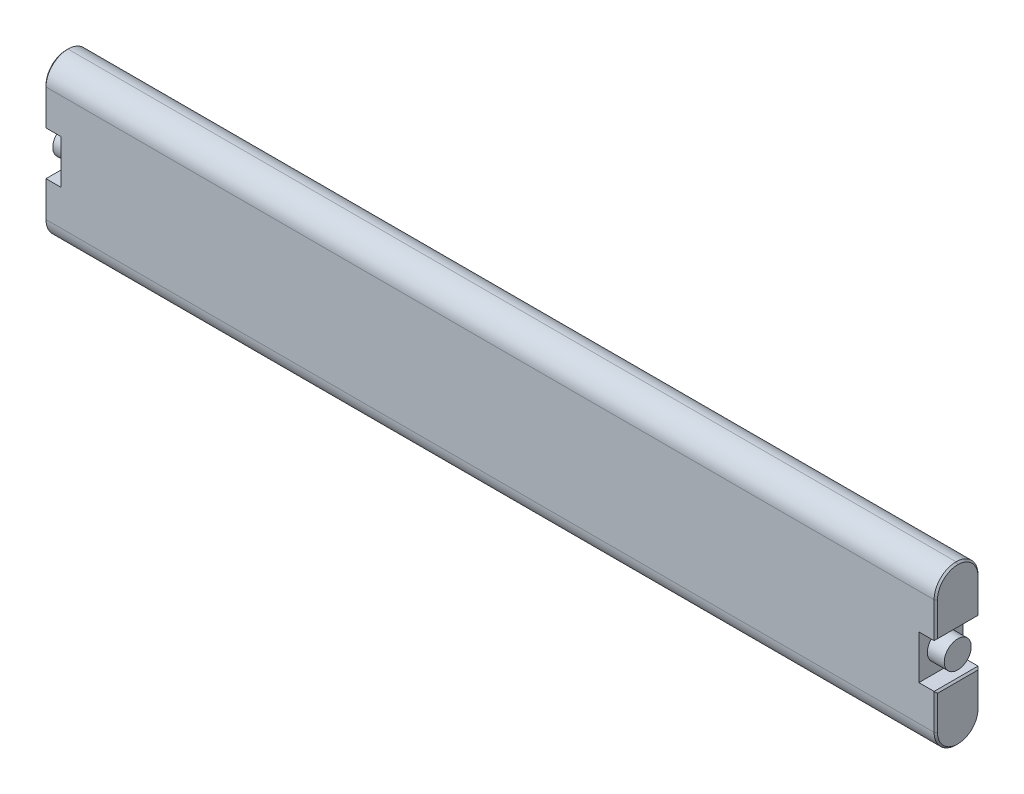
ISO-10303-21;
HEADER;
FILE_DESCRIPTION(('STEP AP214'),'2;1');
FILE_NAME('part.step','',(''),(''),'','','');
FILE_SCHEMA(('AUTOMOTIVE_DESIGN { 1 0 10303 214 1 1 1 1 }'));
ENDSEC;
DATA;
#1=APPLICATION_CONTEXT('core data for automotive mechanical design processes');
#2=APPLICATION_PROTOCOL_DEFINITION('international standard','automotive_design',2000,#1);
#3=PRODUCT_CONTEXT('',#1,'mechanical');
#4=PRODUCT('Part','Part','',(#3));
#5=PRODUCT_RELATED_PRODUCT_CATEGORY('part','',(#4));
#6=PRODUCT_DEFINITION_FORMATION('','',#4);
#7=PRODUCT_DEFINITION_CONTEXT('part definition',#1,'design');
#8=PRODUCT_DEFINITION('design','',#6,#7);
#9=PRODUCT_DEFINITION_SHAPE('','',#8);
#10=(LENGTH_UNIT() NAMED_UNIT(*) SI_UNIT(.MILLI.,.METRE.));
#11=(NAMED_UNIT(*) PLANE_ANGLE_UNIT() SI_UNIT($,.RADIAN.));
#12=(NAMED_UNIT(*) SI_UNIT($,.STERADIAN.) SOLID_ANGLE_UNIT());
#13=UNCERTAINTY_MEASURE_WITH_UNIT(LENGTH_MEASURE(1.E-05),#10,'distance_accuracy_value','');
#14=(GEOMETRIC_REPRESENTATION_CONTEXT(3) GLOBAL_UNCERTAINTY_ASSIGNED_CONTEXT((#13)) GLOBAL_UNIT_ASSIGNED_CONTEXT((#10,
#11,#12)) REPRESENTATION_CONTEXT('',''));
#15=CARTESIAN_POINT('',(0.,0.,0.));
#16=DIRECTION('',(0.,0.,1.));
#17=DIRECTION('',(1.,0.,0.));
#18=AXIS2_PLACEMENT_3D('',#15,#16,#17);
#19=CARTESIAN_POINT('',(-66.,3.25,6.5));
#20=DIRECTION('',(1.,0.,0.));
#21=DIRECTION('',(0.,0.,-1.));
#22=AXIS2_PLACEMENT_3D('',#19,#20,#21);
#23=PLANE('',#22);
#24=DIRECTION('',(0.,-1.,0.));
#25=VECTOR('',#24,1.);
#26=CARTESIAN_POINT('',(-66.,3.25,0.249999999999986));
#27=LINE('',#26,#25);
#28=CARTESIAN_POINT('',(-66.,8.5,0.249999999999986));
#29=VERTEX_POINT('',#28);
#30=CARTESIAN_POINT('',(-66.,3.49999999999999,0.249999999999986));
#31=VERTEX_POINT('',#30);
#32=EDGE_CURVE('E52',#29,#31,#27,.T.);
#33=ORIENTED_EDGE('',*,*,#32,.T.);
#34=DIRECTION('',(0.,0.,1.));
#35=VECTOR('',#34,1.);
#36=CARTESIAN_POINT('',(-66.,3.49999999999999,6.5));
#37=LINE('',#36,#35);
#38=CARTESIAN_POINT('',(-66.,3.49999999999999,6.25000000000001));
#39=VERTEX_POINT('',#38);
#40=EDGE_CURVE('E11',#31,#39,#37,.T.);
#41=ORIENTED_EDGE('',*,*,#40,.T.);
#42=DIRECTION('',(0.,1.,0.));
#43=VECTOR('',#42,1.);
#44=CARTESIAN_POINT('',(-66.,3.25,6.25000000000001));
#45=LINE('',#44,#43);
#46=CARTESIAN_POINT('',(-66.,8.5,6.25000000000001));
#47=VERTEX_POINT('',#46);
#48=EDGE_CURVE('E363',#39,#47,#45,.T.);
#49=ORIENTED_EDGE('',*,*,#48,.T.);
#50=CARTESIAN_POINT('',(-66.,8.5,3.25));
#51=DIRECTION('',(1.,0.,0.));
#52=DIRECTION('',(0.,0.,-1.));
#53=AXIS2_PLACEMENT_3D('',#50,#51,#52);
#54=CIRCLE('',#53,3.00000000000001);
#55=CARTESIAN_POINT('',(-66.,11.5,3.25));
#56=VERTEX_POINT('',#55);
#57=EDGE_CURVE('E365',#47,#56,#54,.F.);
#58=ORIENTED_EDGE('',*,*,#57,.T.);
#59=CARTESIAN_POINT('',(-66.,8.5,3.25));
#60=DIRECTION('',(1.,0.,0.));
#61=DIRECTION('',(0.,0.,-1.));
#62=AXIS2_PLACEMENT_3D('',#59,#60,#61);
#63=CIRCLE('',#62,3.00000000000001);
#64=EDGE_CURVE('E63',#56,#29,#63,.F.);
#65=ORIENTED_EDGE('',*,*,#64,.T.);
#66=EDGE_LOOP('',(#33,#41,#49,#58,#65));
#67=FACE_BOUND('',#66,.T.);
#68=ADVANCED_FACE('F42',(#67),#23,.F.);
#69=CARTESIAN_POINT('',(-63.5,3.25,6.5));
#70=DIRECTION('',(0.,1.,0.));
#71=DIRECTION('',(0.,0.,1.));
#72=AXIS2_PLACEMENT_3D('',#69,#70,#71);
#73=PLANE('',#72);
#74=DIRECTION('',(1.,0.,0.));
#75=VECTOR('',#74,1.);
#76=CARTESIAN_POINT('',(-63.5,3.25,6.5));
#77=LINE('',#76,#75);
#78=CARTESIAN_POINT('',(-65.75,3.25,6.5));
#79=VERTEX_POINT('',#78);
#80=CARTESIAN_POINT('',(-63.5,3.25,6.5));
#81=VERTEX_POINT('',#80);
#82=EDGE_CURVE('E245',#79,#81,#77,.T.);
#83=ORIENTED_EDGE('',*,*,#82,.F.);
#84=DIRECTION('',(0.,0.,-1.));
#85=VECTOR('',#84,1.);
#86=CARTESIAN_POINT('',(-65.75,3.25,6.5));
#87=LINE('',#86,#85);
#88=CARTESIAN_POINT('',(-65.75,3.25,0.));
#89=VERTEX_POINT('',#88);
#90=EDGE_CURVE('E360',#79,#89,#87,.T.);
#91=ORIENTED_EDGE('',*,*,#90,.T.);
#92=DIRECTION('',(1.,0.,0.));
#93=VECTOR('',#92,1.);
#94=CARTESIAN_POINT('',(-63.5,3.25,0.));
#95=LINE('',#94,#93);
#96=CARTESIAN_POINT('',(-63.5,3.25,0.));
#97=VERTEX_POINT('',#96);
#98=EDGE_CURVE('E244',#89,#97,#95,.T.);
#99=ORIENTED_EDGE('',*,*,#98,.T.);
#100=DIRECTION('',(0.,0.,-1.));
#101=VECTOR('',#100,1.);
#102=CARTESIAN_POINT('',(-63.5,3.25,6.5));
#103=LINE('',#102,#101);
#104=EDGE_CURVE('E261',#81,#97,#103,.T.);
#105=ORIENTED_EDGE('',*,*,#104,.F.);
#106=EDGE_LOOP('',(#83,#91,#99,#105));
#107=FACE_BOUND('',#106,.T.);
#108=ADVANCED_FACE('F473',(#107),#73,.F.);
#109=CARTESIAN_POINT('',(-63.5,3.25,6.5));
#110=DIRECTION('',(1.,0.,0.));
#111=DIRECTION('',(0.,0.,-1.));
#112=AXIS2_PLACEMENT_3D('',#109,#110,#111);
#113=PLANE('',#112);
#114=CARTESIAN_POINT('',(-63.5,0.,3.25));
#115=DIRECTION('',(1.,0.,0.));
#116=DIRECTION('',(0.,0.,-1.));
#117=AXIS2_PLACEMENT_3D('',#114,#115,#116);
#118=CIRCLE('',#117,2.);
#119=CARTESIAN_POINT('',(-63.5,0.,1.25));
#120=VERTEX_POINT('',#119);
#121=EDGE_CURVE('E264',#120,#120,#118,.F.);
#122=ORIENTED_EDGE('',*,*,#121,.F.);
#123=EDGE_LOOP('',(#122));
#124=FACE_BOUND('',#123,.T.);
#125=DIRECTION('',(0.,-1.,0.));
#126=VECTOR('',#125,1.);
#127=CARTESIAN_POINT('',(-63.5,3.25,0.));
#128=LINE('',#127,#126);
#129=CARTESIAN_POINT('',(-63.5,-3.25,0.));
#130=VERTEX_POINT('',#129);
#131=EDGE_CURVE('E255',#97,#130,#128,.T.);
#132=ORIENTED_EDGE('',*,*,#131,.T.);
#133=DIRECTION('',(0.,0.,-1.));
#134=VECTOR('',#133,1.);
#135=CARTESIAN_POINT('',(-63.5,-3.25,6.5));
#136=LINE('',#135,#134);
#137=CARTESIAN_POINT('',(-63.5,-3.25,6.5));
#138=VERTEX_POINT('',#137);
#139=EDGE_CURVE('E253',#138,#130,#136,.T.);
#140=ORIENTED_EDGE('',*,*,#139,.F.);
#141=DIRECTION('',(0.,-1.,0.));
#142=VECTOR('',#141,1.);
#143=CARTESIAN_POINT('',(-63.5,3.25,6.5));
#144=LINE('',#143,#142);
#145=EDGE_CURVE('E247',#81,#138,#144,.T.);
#146=ORIENTED_EDGE('',*,*,#145,.F.);
#147=ORIENTED_EDGE('',*,*,#104,.T.);
#148=EDGE_LOOP('',(#132,#140,#146,#147));
#149=FACE_BOUND('',#148,.T.);
#150=ADVANCED_FACE('F492',(#124,#149),#113,.F.);
#151=CARTESIAN_POINT('',(-66.,-3.25,6.5));
#152=DIRECTION('',(0.,-1.,0.));
#153=DIRECTION('',(0.,0.,-1.));
#154=AXIS2_PLACEMENT_3D('',#151,#152,#153);
#155=PLANE('',#154);
#156=DIRECTION('',(-1.,0.,0.));
#157=VECTOR('',#156,1.);
#158=CARTESIAN_POINT('',(-66.,-3.25,0.));
#159=LINE('',#158,#157);
#160=CARTESIAN_POINT('',(-65.75,-3.25,0.));
#161=VERTEX_POINT('',#160);
#162=EDGE_CURVE('E248',#130,#161,#159,.T.);
#163=ORIENTED_EDGE('',*,*,#162,.T.);
#164=DIRECTION('',(0.,0.,1.));
#165=VECTOR('',#164,1.);
#166=CARTESIAN_POINT('',(-65.75,-3.25,6.5));
#167=LINE('',#166,#165);
#168=CARTESIAN_POINT('',(-65.75,-3.25,6.5));
#169=VERTEX_POINT('',#168);
#170=EDGE_CURVE('E357',#161,#169,#167,.T.);
#171=ORIENTED_EDGE('',*,*,#170,.T.);
#172=DIRECTION('',(-1.,0.,0.));
#173=VECTOR('',#172,1.);
#174=CARTESIAN_POINT('',(-66.,-3.25,6.5));
#175=LINE('',#174,#173);
#176=EDGE_CURVE('E250',#138,#169,#175,.T.);
#177=ORIENTED_EDGE('',*,*,#176,.F.);
#178=ORIENTED_EDGE('',*,*,#139,.T.);
#179=EDGE_LOOP('',(#163,#171,#177,#178));
#180=FACE_BOUND('',#179,.T.);
#181=ADVANCED_FACE('F867',(#180),#155,.F.);
#182=CARTESIAN_POINT('',(-66.,-11.75,6.5));
#183=DIRECTION('',(1.,0.,0.));
#184=DIRECTION('',(0.,0.,-1.));
#185=AXIS2_PLACEMENT_3D('',#182,#183,#184);
#186=PLANE('',#185);
#187=DIRECTION('',(0.,1.,0.));
#188=VECTOR('',#187,1.);
#189=CARTESIAN_POINT('',(-66.,-11.75,6.24999999999999));
#190=LINE('',#189,#188);
#191=CARTESIAN_POINT('',(-66.,-8.5,6.24999999999999));
#192=VERTEX_POINT('',#191);
#193=CARTESIAN_POINT('',(-66.,-3.50000000000002,6.24999999999999));
#194=VERTEX_POINT('',#193);
#195=EDGE_CURVE('E352',#192,#194,#190,.T.);
#196=ORIENTED_EDGE('',*,*,#195,.T.);
#197=DIRECTION('',(0.,0.,-1.));
#198=VECTOR('',#197,1.);
#199=CARTESIAN_POINT('',(-66.,-3.50000000000002,6.5));
#200=LINE('',#199,#198);
#201=CARTESIAN_POINT('',(-66.,-3.50000000000002,0.250000000000014));
#202=VERTEX_POINT('',#201);
#203=EDGE_CURVE('E354',#194,#202,#200,.T.);
#204=ORIENTED_EDGE('',*,*,#203,.T.);
#205=DIRECTION('',(0.,-1.,0.));
#206=VECTOR('',#205,1.);
#207=CARTESIAN_POINT('',(-66.,-8.5,0.250000000000014));
#208=LINE('',#207,#206);
#209=CARTESIAN_POINT('',(-66.,-8.5,0.250000000000014));
#210=VERTEX_POINT('',#209);
#211=EDGE_CURVE('E346',#202,#210,#208,.T.);
#212=ORIENTED_EDGE('',*,*,#211,.T.);
#213=CARTESIAN_POINT('',(-66.,-8.5,3.25));
#214=DIRECTION('',(1.,0.,0.));
#215=DIRECTION('',(0.,0.,-1.));
#216=AXIS2_PLACEMENT_3D('',#213,#214,#215);
#217=CIRCLE('',#216,2.99999999999999);
#218=CARTESIAN_POINT('',(-66.,-11.5,3.25));
#219=VERTEX_POINT('',#218);
#220=EDGE_CURVE('E348',#210,#219,#217,.F.);
#221=ORIENTED_EDGE('',*,*,#220,.T.);
#222=CARTESIAN_POINT('',(-66.,-8.5,3.25));
#223=DIRECTION('',(1.,0.,0.));
#224=DIRECTION('',(0.,0.,-1.));
#225=AXIS2_PLACEMENT_3D('',#222,#223,#224);
#226=CIRCLE('',#225,2.99999999999999);
#227=EDGE_CURVE('E350',#219,#192,#226,.F.);
#228=ORIENTED_EDGE('',*,*,#227,.T.);
#229=EDGE_LOOP('',(#196,#204,#212,#221,#228));
#230=FACE_BOUND('',#229,.T.);
#231=ADVANCED_FACE('F858',(#230),#186,.F.);
#232=CARTESIAN_POINT('',(0.,0.,6.5));
#233=DIRECTION('',(0.,0.,-1.));
#234=DIRECTION('',(-1.,0.,0.));
#235=AXIS2_PLACEMENT_3D('',#232,#233,#234);
#236=PLANE('',#235);
#237=DIRECTION('',(1.,0.,0.));
#238=VECTOR('',#237,1.);
#239=CARTESIAN_POINT('',(0.,-8.5,6.5));
#240=LINE('',#239,#238);
#241=CARTESIAN_POINT('',(-65.75,-8.5,6.5));
#242=VERTEX_POINT('',#241);
#243=CARTESIAN_POINT('',(65.75,-8.5,6.5));
#244=VERTEX_POINT('',#243);
#245=EDGE_CURVE('E279',#242,#244,#240,.T.);
#246=ORIENTED_EDGE('',*,*,#245,.T.);
#247=DIRECTION('',(0.,1.,0.));
#248=VECTOR('',#247,1.);
#249=CARTESIAN_POINT('',(65.75,-3.25,6.5));
#250=LINE('',#249,#248);
#251=CARTESIAN_POINT('',(65.75,-3.25,6.5));
#252=VERTEX_POINT('',#251);
#253=EDGE_CURVE('E225',#244,#252,#250,.T.);
#254=ORIENTED_EDGE('',*,*,#253,.T.);
#255=DIRECTION('',(1.,0.,0.));
#256=VECTOR('',#255,1.);
#257=CARTESIAN_POINT('',(66.,-3.25,6.5));
#258=LINE('',#257,#256);
#259=CARTESIAN_POINT('',(63.5,-3.25,6.5));
#260=VERTEX_POINT('',#259);
#261=EDGE_CURVE('E207',#260,#252,#258,.T.);
#262=ORIENTED_EDGE('',*,*,#261,.F.);
#263=DIRECTION('',(0.,-1.,0.));
#264=VECTOR('',#263,1.);
#265=CARTESIAN_POINT('',(63.5,3.25,6.5));
#266=LINE('',#265,#264);
#267=CARTESIAN_POINT('',(63.5,3.25,6.5));
#268=VERTEX_POINT('',#267);
#269=EDGE_CURVE('E223',#268,#260,#266,.T.);
#270=ORIENTED_EDGE('',*,*,#269,.F.);
#271=DIRECTION('',(-1.,0.,0.));
#272=VECTOR('',#271,1.);
#273=CARTESIAN_POINT('',(63.5,3.25,6.5));
#274=LINE('',#273,#272);
#275=CARTESIAN_POINT('',(65.75,3.25,6.5));
#276=VERTEX_POINT('',#275);
#277=EDGE_CURVE('E231',#276,#268,#274,.T.);
#278=ORIENTED_EDGE('',*,*,#277,.F.);
#279=DIRECTION('',(0.,1.,0.));
#280=VECTOR('',#279,1.);
#281=CARTESIAN_POINT('',(65.75,8.5,6.5));
#282=LINE('',#281,#280);
#283=CARTESIAN_POINT('',(65.75,8.5,6.5));
#284=VERTEX_POINT('',#283);
#285=EDGE_CURVE('E303',#276,#284,#282,.T.);
#286=ORIENTED_EDGE('',*,*,#285,.T.);
#287=DIRECTION('',(-1.,0.,0.));
#288=VECTOR('',#287,1.);
#289=CARTESIAN_POINT('',(0.,8.5,6.5));
#290=LINE('',#289,#288);
#291=CARTESIAN_POINT('',(-65.75,8.5,6.5));
#292=VERTEX_POINT('',#291);
#293=EDGE_CURVE('E276',#284,#292,#290,.T.);
#294=ORIENTED_EDGE('',*,*,#293,.T.);
#295=DIRECTION('',(0.,-1.,0.));
#296=VECTOR('',#295,1.);
#297=CARTESIAN_POINT('',(-65.75,0.,6.5));
#298=LINE('',#297,#296);
#299=EDGE_CURVE('E299',#292,#79,#298,.T.);
#300=ORIENTED_EDGE('',*,*,#299,.T.);
#301=ORIENTED_EDGE('',*,*,#82,.T.);
#302=ORIENTED_EDGE('',*,*,#145,.T.);
#303=ORIENTED_EDGE('',*,*,#176,.T.);
#304=DIRECTION('',(0.,-1.,0.));
#305=VECTOR('',#304,1.);
#306=CARTESIAN_POINT('',(-65.75,0.,6.5));
#307=LINE('',#306,#305);
#308=EDGE_CURVE('E301',#169,#242,#307,.T.);
#309=ORIENTED_EDGE('',*,*,#308,.T.);
#310=EDGE_LOOP('',(#246,#254,#262,#270,#278,#286,#294,#300,#301,#302,#303,#309));
#311=FACE_BOUND('',#310,.T.);
#312=ADVANCED_FACE('F221',(#311),#236,.F.);
#313=CARTESIAN_POINT('',(0.,0.,0.));
#314=DIRECTION('',(0.,0.,-1.));
#315=DIRECTION('',(-1.,0.,0.));
#316=AXIS2_PLACEMENT_3D('',#313,#314,#315);
#317=PLANE('',#316);
#318=DIRECTION('',(1.,0.,0.));
#319=VECTOR('',#318,1.);
#320=CARTESIAN_POINT('',(66.,-3.25,0.));
#321=LINE('',#320,#319);
#322=CARTESIAN_POINT('',(63.5,-3.25,0.));
#323=VERTEX_POINT('',#322);
#324=CARTESIAN_POINT('',(65.75,-3.25,0.));
#325=VERTEX_POINT('',#324);
#326=EDGE_CURVE('E209',#323,#325,#321,.T.);
#327=ORIENTED_EDGE('',*,*,#326,.T.);
#328=DIRECTION('',(0.,-1.,0.));
#329=VECTOR('',#328,1.);
#330=CARTESIAN_POINT('',(65.75,0.,0.));
#331=LINE('',#330,#329);
#332=CARTESIAN_POINT('',(65.75,-8.5,0.));
#333=VERTEX_POINT('',#332);
#334=EDGE_CURVE('E315',#325,#333,#331,.T.);
#335=ORIENTED_EDGE('',*,*,#334,.T.);
#336=DIRECTION('',(1.,0.,0.));
#337=VECTOR('',#336,1.);
#338=CARTESIAN_POINT('',(-66.,-8.5,0.));
#339=LINE('',#338,#337);
#340=CARTESIAN_POINT('',(-65.75,-8.5,0.));
#341=VERTEX_POINT('',#340);
#342=EDGE_CURVE('E273',#333,#341,#339,.F.);
#343=ORIENTED_EDGE('',*,*,#342,.T.);
#344=DIRECTION('',(0.,1.,0.));
#345=VECTOR('',#344,1.);
#346=CARTESIAN_POINT('',(-65.75,-3.25,0.));
#347=LINE('',#346,#345);
#348=EDGE_CURVE('E310',#341,#161,#347,.T.);
#349=ORIENTED_EDGE('',*,*,#348,.T.);
#350=ORIENTED_EDGE('',*,*,#162,.F.);
#351=ORIENTED_EDGE('',*,*,#131,.F.);
#352=ORIENTED_EDGE('',*,*,#98,.F.);
#353=DIRECTION('',(0.,1.,0.));
#354=VECTOR('',#353,1.);
#355=CARTESIAN_POINT('',(-65.75,8.5,0.));
#356=LINE('',#355,#354);
#357=CARTESIAN_POINT('',(-65.75,8.5,0.));
#358=VERTEX_POINT('',#357);
#359=EDGE_CURVE('E308',#89,#358,#356,.T.);
#360=ORIENTED_EDGE('',*,*,#359,.T.);
#361=DIRECTION('',(-1.,0.,0.));
#362=VECTOR('',#361,1.);
#363=CARTESIAN_POINT('',(66.,8.5,0.));
#364=LINE('',#363,#362);
#365=CARTESIAN_POINT('',(65.75,8.5,0.));
#366=VERTEX_POINT('',#365);
#367=EDGE_CURVE('E270',#358,#366,#364,.F.);
#368=ORIENTED_EDGE('',*,*,#367,.T.);
#369=DIRECTION('',(0.,-1.,0.));
#370=VECTOR('',#369,1.);
#371=CARTESIAN_POINT('',(65.75,0.,0.));
#372=LINE('',#371,#370);
#373=CARTESIAN_POINT('',(65.75,3.25,0.));
#374=VERTEX_POINT('',#373);
#375=EDGE_CURVE('E312',#366,#374,#372,.T.);
#376=ORIENTED_EDGE('',*,*,#375,.T.);
#377=DIRECTION('',(-1.,0.,0.));
#378=VECTOR('',#377,1.);
#379=CARTESIAN_POINT('',(63.5,3.25,0.));
#380=LINE('',#379,#378);
#381=CARTESIAN_POINT('',(63.5,3.25,0.));
#382=VERTEX_POINT('',#381);
#383=EDGE_CURVE('E226',#374,#382,#380,.T.);
#384=ORIENTED_EDGE('',*,*,#383,.T.);
#385=DIRECTION('',(0.,-1.,0.));
#386=VECTOR('',#385,1.);
#387=CARTESIAN_POINT('',(63.5,3.25,0.));
#388=LINE('',#387,#386);
#389=EDGE_CURVE('E237',#382,#323,#388,.T.);
#390=ORIENTED_EDGE('',*,*,#389,.T.);
#391=EDGE_LOOP('',(#327,#335,#343,#349,#350,#351,#352,#360,#368,#376,#384,#390));
#392=FACE_BOUND('',#391,.T.);
#393=ADVANCED_FACE('F463',(#392),#317,.T.);
#394=CARTESIAN_POINT('',(-66.,0.,3.25));
#395=DIRECTION('',(1.,0.,0.));
#396=DIRECTION('',(0.,0.,-1.));
#397=AXIS2_PLACEMENT_3D('',#394,#395,#396);
#398=CYLINDRICAL_SURFACE('',#397,2.);
#399=CARTESIAN_POINT('',(-66.,0.,3.25));
#400=DIRECTION('',(-1.,0.,0.));
#401=DIRECTION('',(0.,0.,1.));
#402=AXIS2_PLACEMENT_3D('',#399,#400,#401);
#403=CIRCLE('',#402,2.);
#404=CARTESIAN_POINT('',(-66.,0.,5.25));
#405=VERTEX_POINT('',#404);
#406=EDGE_CURVE('E214',#405,#405,#403,.T.);
#407=ORIENTED_EDGE('',*,*,#406,.F.);
#408=EDGE_LOOP('',(#407));
#409=FACE_BOUND('',#408,.T.);
#410=ORIENTED_EDGE('',*,*,#121,.T.);
#411=EDGE_LOOP('',(#410));
#412=FACE_BOUND('',#411,.T.);
#413=ADVANCED_FACE('F831',(#409,#412),#398,.T.);
#414=CARTESIAN_POINT('',(-66.,0.,3.25));
#415=DIRECTION('',(-1.,0.,0.));
#416=DIRECTION('',(0.,0.,1.));
#417=AXIS2_PLACEMENT_3D('',#414,#415,#416);
#418=PLANE('',#417);
#419=ORIENTED_EDGE('',*,*,#406,.T.);
#420=EDGE_LOOP('',(#419));
#421=FACE_BOUND('',#420,.T.);
#422=ADVANCED_FACE('F821',(#421),#418,.T.);
#423=CARTESIAN_POINT('',(66.,-11.75,6.5));
#424=DIRECTION('',(1.,0.,0.));
#425=DIRECTION('',(0.,0.,-1.));
#426=AXIS2_PLACEMENT_3D('',#423,#424,#425);
#427=PLANE('',#426);
#428=DIRECTION('',(0.,0.,1.));
#429=VECTOR('',#428,1.);
#430=CARTESIAN_POINT('',(66.,-3.50000000000002,6.5));
#431=LINE('',#430,#429);
#432=CARTESIAN_POINT('',(66.,-3.50000000000002,0.25000000000002));
#433=VERTEX_POINT('',#432);
#434=CARTESIAN_POINT('',(66.,-3.50000000000002,6.24999999999998));
#435=VERTEX_POINT('',#434);
#436=EDGE_CURVE('E294',#433,#435,#431,.T.);
#437=ORIENTED_EDGE('',*,*,#436,.T.);
#438=DIRECTION('',(0.,-1.,0.));
#439=VECTOR('',#438,1.);
#440=CARTESIAN_POINT('',(66.,-8.5,6.24999999999998));
#441=LINE('',#440,#439);
#442=CARTESIAN_POINT('',(66.,-8.5,6.24999999999998));
#443=VERTEX_POINT('',#442);
#444=EDGE_CURVE('E296',#435,#443,#441,.T.);
#445=ORIENTED_EDGE('',*,*,#444,.T.);
#446=CARTESIAN_POINT('',(66.,-8.5,3.25));
#447=DIRECTION('',(1.,0.,0.));
#448=DIRECTION('',(0.,0.,-1.));
#449=AXIS2_PLACEMENT_3D('',#446,#447,#448);
#450=CIRCLE('',#449,2.99999999999998);
#451=CARTESIAN_POINT('',(66.,-11.5,3.25));
#452=VERTEX_POINT('',#451);
#453=EDGE_CURVE('E281',#443,#452,#450,.T.);
#454=ORIENTED_EDGE('',*,*,#453,.T.);
#455=CARTESIAN_POINT('',(66.,-8.5,3.25));
#456=DIRECTION('',(1.,0.,0.));
#457=DIRECTION('',(0.,0.,-1.));
#458=AXIS2_PLACEMENT_3D('',#455,#456,#457);
#459=CIRCLE('',#458,2.99999999999998);
#460=CARTESIAN_POINT('',(66.,-8.5,0.25000000000002));
#461=VERTEX_POINT('',#460);
#462=EDGE_CURVE('E290',#452,#461,#459,.T.);
#463=ORIENTED_EDGE('',*,*,#462,.T.);
#464=DIRECTION('',(0.,1.,0.));
#465=VECTOR('',#464,1.);
#466=CARTESIAN_POINT('',(66.,-11.75,0.25000000000002));
#467=LINE('',#466,#465);
#468=EDGE_CURVE('E292',#461,#433,#467,.T.);
#469=ORIENTED_EDGE('',*,*,#468,.T.);
#470=EDGE_LOOP('',(#437,#445,#454,#463,#469));
#471=FACE_BOUND('',#470,.T.);
#472=ADVANCED_FACE('F812',(#471),#427,.T.);
#473=CARTESIAN_POINT('',(66.,-3.25,6.5));
#474=DIRECTION('',(0.,1.,0.));
#475=DIRECTION('',(0.,0.,1.));
#476=AXIS2_PLACEMENT_3D('',#473,#474,#475);
#477=PLANE('',#476);
#478=ORIENTED_EDGE('',*,*,#261,.T.);
#479=DIRECTION('',(0.,0.,-1.));
#480=VECTOR('',#479,1.);
#481=CARTESIAN_POINT('',(65.75,-3.25,6.5));
#482=LINE('',#481,#480);
#483=EDGE_CURVE('E306',#252,#325,#482,.T.);
#484=ORIENTED_EDGE('',*,*,#483,.T.);
#485=ORIENTED_EDGE('',*,*,#326,.F.);
#486=DIRECTION('',(0.,0.,-1.));
#487=VECTOR('',#486,1.);
#488=CARTESIAN_POINT('',(63.5,-3.25,6.5));
#489=LINE('',#488,#487);
#490=EDGE_CURVE('E204',#260,#323,#489,.T.);
#491=ORIENTED_EDGE('',*,*,#490,.F.);
#492=EDGE_LOOP('',(#478,#484,#485,#491));
#493=FACE_BOUND('',#492,.T.);
#494=ADVANCED_FACE('F206',(#493),#477,.T.);
#495=CARTESIAN_POINT('',(63.5,3.25,6.5));
#496=DIRECTION('',(1.,0.,0.));
#497=DIRECTION('',(0.,0.,-1.));
#498=AXIS2_PLACEMENT_3D('',#495,#496,#497);
#499=PLANE('',#498);
#500=CARTESIAN_POINT('',(63.5,0.,3.25));
#501=DIRECTION('',(1.,0.,0.));
#502=DIRECTION('',(0.,0.,-1.));
#503=AXIS2_PLACEMENT_3D('',#500,#501,#502);
#504=CIRCLE('',#503,2.);
#505=CARTESIAN_POINT('',(63.5,0.,1.25));
#506=VERTEX_POINT('',#505);
#507=EDGE_CURVE('E267',#506,#506,#504,.T.);
#508=ORIENTED_EDGE('',*,*,#507,.F.);
#509=EDGE_LOOP('',(#508));
#510=FACE_BOUND('',#509,.T.);
#511=ORIENTED_EDGE('',*,*,#389,.F.);
#512=DIRECTION('',(0.,0.,-1.));
#513=VECTOR('',#512,1.);
#514=CARTESIAN_POINT('',(63.5,3.25,6.5));
#515=LINE('',#514,#513);
#516=EDGE_CURVE('E215',#268,#382,#515,.T.);
#517=ORIENTED_EDGE('',*,*,#516,.F.);
#518=ORIENTED_EDGE('',*,*,#269,.T.);
#519=ORIENTED_EDGE('',*,*,#490,.T.);
#520=EDGE_LOOP('',(#511,#517,#518,#519));
#521=FACE_BOUND('',#520,.T.);
#522=ADVANCED_FACE('F229',(#510,#521),#499,.T.);
#523=CARTESIAN_POINT('',(63.5,3.25,6.5));
#524=DIRECTION('',(0.,-1.,0.));
#525=DIRECTION('',(0.,0.,-1.));
#526=AXIS2_PLACEMENT_3D('',#523,#524,#525);
#527=PLANE('',#526);
#528=ORIENTED_EDGE('',*,*,#383,.F.);
#529=DIRECTION('',(0.,0.,1.));
#530=VECTOR('',#529,1.);
#531=CARTESIAN_POINT('',(65.75,3.25,6.5));
#532=LINE('',#531,#530);
#533=EDGE_CURVE('E336',#374,#276,#532,.T.);
#534=ORIENTED_EDGE('',*,*,#533,.T.);
#535=ORIENTED_EDGE('',*,*,#277,.T.);
#536=ORIENTED_EDGE('',*,*,#516,.T.);
#537=EDGE_LOOP('',(#528,#534,#535,#536));
#538=FACE_BOUND('',#537,.T.);
#539=ADVANCED_FACE('F785',(#538),#527,.T.);
#540=CARTESIAN_POINT('',(66.,3.25,6.5));
#541=DIRECTION('',(1.,0.,0.));
#542=DIRECTION('',(0.,0.,-1.));
#543=AXIS2_PLACEMENT_3D('',#540,#541,#542);
#544=PLANE('',#543);
#545=DIRECTION('',(0.,0.,-1.));
#546=VECTOR('',#545,1.);
#547=CARTESIAN_POINT('',(66.,3.5,6.5));
#548=LINE('',#547,#546);
#549=CARTESIAN_POINT('',(66.,3.5,6.25));
#550=VERTEX_POINT('',#549);
#551=CARTESIAN_POINT('',(66.,3.5,0.25));
#552=VERTEX_POINT('',#551);
#553=EDGE_CURVE('E331',#550,#552,#548,.T.);
#554=ORIENTED_EDGE('',*,*,#553,.T.);
#555=DIRECTION('',(0.,1.,0.));
#556=VECTOR('',#555,1.);
#557=CARTESIAN_POINT('',(66.,3.25,0.25));
#558=LINE('',#557,#556);
#559=CARTESIAN_POINT('',(66.,8.5,0.250000000000001));
#560=VERTEX_POINT('',#559);
#561=EDGE_CURVE('E333',#552,#560,#558,.T.);
#562=ORIENTED_EDGE('',*,*,#561,.T.);
#563=CARTESIAN_POINT('',(66.,8.5,3.25));
#564=DIRECTION('',(1.,0.,0.));
#565=DIRECTION('',(0.,0.,-1.));
#566=AXIS2_PLACEMENT_3D('',#563,#564,#565);
#567=CIRCLE('',#566,3.);
#568=CARTESIAN_POINT('',(66.,11.5,3.25));
#569=VERTEX_POINT('',#568);
#570=EDGE_CURVE('E325',#560,#569,#567,.T.);
#571=ORIENTED_EDGE('',*,*,#570,.T.);
#572=CARTESIAN_POINT('',(66.,8.5,3.25));
#573=DIRECTION('',(1.,0.,0.));
#574=DIRECTION('',(0.,0.,-1.));
#575=AXIS2_PLACEMENT_3D('',#572,#573,#574);
#576=CIRCLE('',#575,3.);
#577=CARTESIAN_POINT('',(66.,8.5,6.25));
#578=VERTEX_POINT('',#577);
#579=EDGE_CURVE('E327',#569,#578,#576,.T.);
#580=ORIENTED_EDGE('',*,*,#579,.T.);
#581=DIRECTION('',(0.,-1.,0.));
#582=VECTOR('',#581,1.);
#583=CARTESIAN_POINT('',(66.,3.25,6.25));
#584=LINE('',#583,#582);
#585=EDGE_CURVE('E329',#578,#550,#584,.T.);
#586=ORIENTED_EDGE('',*,*,#585,.T.);
#587=EDGE_LOOP('',(#554,#562,#571,#580,#586));
#588=FACE_BOUND('',#587,.T.);
#589=ADVANCED_FACE('F446',(#588),#544,.T.);
#590=CARTESIAN_POINT('',(66.,0.,3.25));
#591=DIRECTION('',(-1.,0.,0.));
#592=DIRECTION('',(0.,0.,1.));
#593=AXIS2_PLACEMENT_3D('',#590,#591,#592);
#594=CYLINDRICAL_SURFACE('',#593,2.);
#595=CARTESIAN_POINT('',(66.,0.,3.25));
#596=DIRECTION('',(-1.,0.,0.));
#597=DIRECTION('',(0.,0.,1.));
#598=AXIS2_PLACEMENT_3D('',#595,#596,#597);
#599=CIRCLE('',#598,2.);
#600=CARTESIAN_POINT('',(66.,0.,5.25));
#601=VERTEX_POINT('',#600);
#602=EDGE_CURVE('E238',#601,#601,#599,.T.);
#603=ORIENTED_EDGE('',*,*,#602,.T.);
#604=EDGE_LOOP('',(#603));
#605=FACE_BOUND('',#604,.T.);
#606=ORIENTED_EDGE('',*,*,#507,.T.);
#607=EDGE_LOOP('',(#606));
#608=FACE_BOUND('',#607,.T.);
#609=ADVANCED_FACE('F765',(#605,#608),#594,.T.);
#610=CARTESIAN_POINT('',(66.,0.,3.25));
#611=DIRECTION('',(1.,0.,0.));
#612=DIRECTION('',(0.,0.,1.));
#613=AXIS2_PLACEMENT_3D('',#610,#611,#612);
#614=PLANE('',#613);
#615=ORIENTED_EDGE('',*,*,#602,.F.);
#616=EDGE_LOOP('',(#615));
#617=FACE_BOUND('',#616,.T.);
#618=ADVANCED_FACE('F503',(#617),#614,.T.);
#619=CARTESIAN_POINT('',(0.,-8.5,3.25));
#620=DIRECTION('',(1.,0.,0.));
#621=DIRECTION('',(0.,1.,0.));
#622=AXIS2_PLACEMENT_3D('',#619,#620,#621);
#623=CYLINDRICAL_SURFACE('',#622,3.25);
#624=DIRECTION('',(1.,0.,0.));
#625=VECTOR('',#624,1.);
#626=CARTESIAN_POINT('',(0.,-11.75,3.25));
#627=LINE('',#626,#625);
#628=CARTESIAN_POINT('',(65.75,-11.75,3.25));
#629=VERTEX_POINT('',#628);
#630=CARTESIAN_POINT('',(-65.75,-11.75,3.25));
#631=VERTEX_POINT('',#630);
#632=EDGE_CURVE('E282',#629,#631,#627,.F.);
#633=ORIENTED_EDGE('',*,*,#632,.F.);
#634=CARTESIAN_POINT('',(65.75,-8.5,3.25));
#635=DIRECTION('',(1.,0.,0.));
#636=DIRECTION('',(0.,0.,-1.));
#637=AXIS2_PLACEMENT_3D('',#634,#635,#636);
#638=CIRCLE('',#637,3.25);
#639=EDGE_CURVE('E323',#629,#244,#638,.F.);
#640=ORIENTED_EDGE('',*,*,#639,.T.);
#641=ORIENTED_EDGE('',*,*,#245,.F.);
#642=CARTESIAN_POINT('',(-65.75,-8.5,3.25));
#643=DIRECTION('',(1.,0.,0.));
#644=DIRECTION('',(0.,0.,-1.));
#645=AXIS2_PLACEMENT_3D('',#642,#643,#644);
#646=CIRCLE('',#645,3.25);
#647=EDGE_CURVE('E321',#242,#631,#646,.T.);
#648=ORIENTED_EDGE('',*,*,#647,.T.);
#649=EDGE_LOOP('',(#633,#640,#641,#648));
#650=FACE_BOUND('',#649,.T.);
#651=ADVANCED_FACE('F499',(#650),#623,.T.);
#652=CARTESIAN_POINT('',(0.,-8.5,3.25));
#653=DIRECTION('',(-1.,0.,0.));
#654=DIRECTION('',(0.,-1.,0.));
#655=AXIS2_PLACEMENT_3D('',#652,#653,#654);
#656=CYLINDRICAL_SURFACE('',#655,3.25);
#657=ORIENTED_EDGE('',*,*,#342,.F.);
#658=CARTESIAN_POINT('',(65.75,-8.5,3.25));
#659=DIRECTION('',(1.,0.,0.));
#660=DIRECTION('',(0.,0.,-1.));
#661=AXIS2_PLACEMENT_3D('',#658,#659,#660);
#662=CIRCLE('',#661,3.25);
#663=EDGE_CURVE('E319',#333,#629,#662,.F.);
#664=ORIENTED_EDGE('',*,*,#663,.T.);
#665=ORIENTED_EDGE('',*,*,#632,.T.);
#666=CARTESIAN_POINT('',(-65.75,-8.5,3.25));
#667=DIRECTION('',(1.,0.,0.));
#668=DIRECTION('',(0.,0.,-1.));
#669=AXIS2_PLACEMENT_3D('',#666,#667,#668);
#670=CIRCLE('',#669,3.25);
#671=EDGE_CURVE('E317',#631,#341,#670,.T.);
#672=ORIENTED_EDGE('',*,*,#671,.T.);
#673=EDGE_LOOP('',(#657,#664,#665,#672));
#674=FACE_BOUND('',#673,.T.);
#675=ADVANCED_FACE('F496',(#674),#656,.T.);
#676=CARTESIAN_POINT('',(-66.,8.5,3.25));
#677=DIRECTION('',(1.,0.,0.));
#678=DIRECTION('',(0.,1.,0.));
#679=AXIS2_PLACEMENT_3D('',#676,#677,#678);
#680=CYLINDRICAL_SURFACE('',#679,3.25);
#681=DIRECTION('',(-1.,0.,0.));
#682=VECTOR('',#681,1.);
#683=CARTESIAN_POINT('',(-66.,11.75,3.25));
#684=LINE('',#683,#682);
#685=CARTESIAN_POINT('',(65.75,11.75,3.25));
#686=VERTEX_POINT('',#685);
#687=CARTESIAN_POINT('',(-65.75,11.75,3.25));
#688=VERTEX_POINT('',#687);
#689=EDGE_CURVE('E285',#686,#688,#684,.T.);
#690=ORIENTED_EDGE('',*,*,#689,.F.);
#691=CARTESIAN_POINT('',(65.75,8.5,3.25));
#692=DIRECTION('',(1.,0.,0.));
#693=DIRECTION('',(0.,0.,-1.));
#694=AXIS2_PLACEMENT_3D('',#691,#692,#693);
#695=CIRCLE('',#694,3.25);
#696=EDGE_CURVE('E344',#686,#366,#695,.F.);
#697=ORIENTED_EDGE('',*,*,#696,.T.);
#698=ORIENTED_EDGE('',*,*,#367,.F.);
#699=CARTESIAN_POINT('',(-65.75,8.5,3.25));
#700=DIRECTION('',(1.,0.,0.));
#701=DIRECTION('',(0.,0.,-1.));
#702=AXIS2_PLACEMENT_3D('',#699,#700,#701);
#703=CIRCLE('',#702,3.25);
#704=EDGE_CURVE('E342',#358,#688,#703,.T.);
#705=ORIENTED_EDGE('',*,*,#704,.T.);
#706=EDGE_LOOP('',(#690,#697,#698,#705));
#707=FACE_BOUND('',#706,.T.);
#708=ADVANCED_FACE('F460',(#707),#680,.T.);
#709=CARTESIAN_POINT('',(0.,8.5,3.25));
#710=DIRECTION('',(-1.,0.,0.));
#711=DIRECTION('',(0.,-1.,0.));
#712=AXIS2_PLACEMENT_3D('',#709,#710,#711);
#713=CYLINDRICAL_SURFACE('',#712,3.25);
#714=ORIENTED_EDGE('',*,*,#293,.F.);
#715=CARTESIAN_POINT('',(65.75,8.5,3.25));
#716=DIRECTION('',(1.,0.,0.));
#717=DIRECTION('',(0.,0.,-1.));
#718=AXIS2_PLACEMENT_3D('',#715,#716,#717);
#719=CIRCLE('',#718,3.25);
#720=EDGE_CURVE('E340',#284,#686,#719,.F.);
#721=ORIENTED_EDGE('',*,*,#720,.T.);
#722=ORIENTED_EDGE('',*,*,#689,.T.);
#723=CARTESIAN_POINT('',(-65.75,8.5,3.25));
#724=DIRECTION('',(1.,0.,0.));
#725=DIRECTION('',(0.,0.,-1.));
#726=AXIS2_PLACEMENT_3D('',#723,#724,#725);
#727=CIRCLE('',#726,3.25);
#728=EDGE_CURVE('E338',#688,#292,#727,.T.);
#729=ORIENTED_EDGE('',*,*,#728,.T.);
#730=EDGE_LOOP('',(#714,#721,#722,#729));
#731=FACE_BOUND('',#730,.T.);
#732=ADVANCED_FACE('F429',(#731),#713,.T.);
#733=CARTESIAN_POINT('',(65.75,0.,0.));
#734=DIRECTION('',(-0.707106781186556,0.,0.707106781186539));
#735=DIRECTION('',(0.,-1.,0.));
#736=AXIS2_PLACEMENT_3D('',#733,#734,#735);
#737=PLANE('',#736);
#738=DIRECTION('',(0.577350269189616,-0.577350269189632,0.57735026918963));
#739=VECTOR('',#738,1.);
#740=CARTESIAN_POINT('',(64.6666666666667,-2.16666666666664,-1.08333333333335));
#741=LINE('',#740,#739);
#742=EDGE_CURVE('E377',#433,#325,#741,.F.);
#743=ORIENTED_EDGE('',*,*,#742,.F.);
#744=ORIENTED_EDGE('',*,*,#468,.F.);
#745=DIRECTION('',(0.707106781186539,0.,0.707106781186556));
#746=VECTOR('',#745,1.);
#747=CARTESIAN_POINT('',(65.75,-8.5,0.));
#748=LINE('',#747,#746);
#749=EDGE_CURVE('E288',#333,#461,#748,.T.);
#750=ORIENTED_EDGE('',*,*,#749,.F.);
#751=ORIENTED_EDGE('',*,*,#334,.F.);
#752=EDGE_LOOP('',(#743,#744,#750,#751));
#753=FACE_BOUND('',#752,.T.);
#754=ADVANCED_FACE('F507',(#753),#737,.F.);
#755=CARTESIAN_POINT('',(66.,-8.5,3.25));
#756=DIRECTION('',(-1.,0.,0.));
#757=DIRECTION('',(0.,0.,1.));
#758=AXIS2_PLACEMENT_3D('',#755,#756,#757);
#759=CONICAL_SURFACE('',#758,2.99999999999998,0.78539816339746);
#760=ORIENTED_EDGE('',*,*,#749,.T.);
#761=ORIENTED_EDGE('',*,*,#462,.F.);
#762=DIRECTION('',(0.70710678118654,0.707106781186555,0.));
#763=VECTOR('',#762,1.);
#764=CARTESIAN_POINT('',(65.75,-11.75,3.25));
#765=LINE('',#764,#763);
#766=EDGE_CURVE('E374',#629,#452,#765,.T.);
#767=ORIENTED_EDGE('',*,*,#766,.F.);
#768=ORIENTED_EDGE('',*,*,#663,.F.);
#769=EDGE_LOOP('',(#760,#761,#767,#768));
#770=FACE_BOUND('',#769,.T.);
#771=ADVANCED_FACE('F532',(#770),#759,.T.);
#772=CARTESIAN_POINT('',(65.75,-3.25,6.5));
#773=DIRECTION('',(-0.707106781186557,-0.707106781186538,0.));
#774=DIRECTION('',(0.,0.,-1.));
#775=AXIS2_PLACEMENT_3D('',#772,#773,#774);
#776=PLANE('',#775);
#777=ORIENTED_EDGE('',*,*,#742,.T.);
#778=ORIENTED_EDGE('',*,*,#483,.F.);
#779=DIRECTION('',(-0.577350269189616,0.577350269189632,0.57735026918963));
#780=VECTOR('',#779,1.);
#781=CARTESIAN_POINT('',(65.75,-3.25,6.5));
#782=LINE('',#781,#780);
#783=EDGE_CURVE('E371',#435,#252,#782,.T.);
#784=ORIENTED_EDGE('',*,*,#783,.F.);
#785=ORIENTED_EDGE('',*,*,#436,.F.);
#786=EDGE_LOOP('',(#777,#778,#784,#785));
#787=FACE_BOUND('',#786,.T.);
#788=ADVANCED_FACE('F525',(#787),#776,.F.);
#789=CARTESIAN_POINT('',(66.,-8.5,3.25));
#790=DIRECTION('',(-1.,0.,0.));
#791=DIRECTION('',(0.,0.,1.));
#792=AXIS2_PLACEMENT_3D('',#789,#790,#791);
#793=CONICAL_SURFACE('',#792,2.99999999999998,0.78539816339746);
#794=ORIENTED_EDGE('',*,*,#766,.T.);
#795=ORIENTED_EDGE('',*,*,#453,.F.);
#796=DIRECTION('',(0.707106781186539,0.,-0.707106781186556));
#797=VECTOR('',#796,1.);
#798=CARTESIAN_POINT('',(65.75,-8.5,6.5));
#799=LINE('',#798,#797);
#800=EDGE_CURVE('E369',#244,#443,#799,.T.);
#801=ORIENTED_EDGE('',*,*,#800,.F.);
#802=ORIENTED_EDGE('',*,*,#639,.F.);
#803=EDGE_LOOP('',(#794,#795,#801,#802));
#804=FACE_BOUND('',#803,.T.);
#805=ADVANCED_FACE('F518',(#804),#793,.T.);
#806=CARTESIAN_POINT('',(66.,-11.75,6.24999999999998));
#807=DIRECTION('',(0.707106781186556,0.,0.707106781186539));
#808=DIRECTION('',(0.,1.,0.));
#809=AXIS2_PLACEMENT_3D('',#806,#807,#808);
#810=PLANE('',#809);
#811=ORIENTED_EDGE('',*,*,#783,.T.);
#812=ORIENTED_EDGE('',*,*,#253,.F.);
#813=ORIENTED_EDGE('',*,*,#800,.T.);
#814=ORIENTED_EDGE('',*,*,#444,.F.);
#815=EDGE_LOOP('',(#811,#812,#813,#814));
#816=FACE_BOUND('',#815,.T.);
#817=ADVANCED_FACE('F511',(#816),#810,.T.);
#818=CARTESIAN_POINT('',(66.,8.5,3.25));
#819=DIRECTION('',(-1.,0.,0.));
#820=DIRECTION('',(0.,0.,1.));
#821=AXIS2_PLACEMENT_3D('',#818,#819,#820);
#822=CONICAL_SURFACE('',#821,3.,0.785398163397449);
#823=DIRECTION('',(0.707106781186547,-0.707106781186547,0.));
#824=VECTOR('',#823,1.);
#825=CARTESIAN_POINT('',(65.75,11.75,3.25));
#826=LINE('',#825,#824);
#827=EDGE_CURVE('E390',#686,#569,#826,.T.);
#828=ORIENTED_EDGE('',*,*,#827,.F.);
#829=ORIENTED_EDGE('',*,*,#720,.F.);
#830=DIRECTION('',(-0.707106781186547,0.,0.707106781186547));
#831=VECTOR('',#830,1.);
#832=CARTESIAN_POINT('',(66.,8.5,6.25));
#833=LINE('',#832,#831);
#834=EDGE_CURVE('E372',#578,#284,#833,.T.);
#835=ORIENTED_EDGE('',*,*,#834,.F.);
#836=ORIENTED_EDGE('',*,*,#579,.F.);
#837=EDGE_LOOP('',(#828,#829,#835,#836));
#838=FACE_BOUND('',#837,.T.);
#839=ADVANCED_FACE('F458',(#838),#822,.T.);
#840=CARTESIAN_POINT('',(66.,3.25,6.25));
#841=DIRECTION('',(0.707106781186547,0.,0.707106781186547));
#842=DIRECTION('',(0.,1.,0.));
#843=AXIS2_PLACEMENT_3D('',#840,#841,#842);
#844=PLANE('',#843);
#845=ORIENTED_EDGE('',*,*,#834,.T.);
#846=ORIENTED_EDGE('',*,*,#285,.F.);
#847=DIRECTION('',(-0.577350269189626,-0.577350269189626,0.577350269189626));
#848=VECTOR('',#847,1.);
#849=CARTESIAN_POINT('',(65.9166666666667,3.41666666666667,6.33333333333333));
#850=LINE('',#849,#848);
#851=EDGE_CURVE('E387',#550,#276,#850,.T.);
#852=ORIENTED_EDGE('',*,*,#851,.F.);
#853=ORIENTED_EDGE('',*,*,#585,.F.);
#854=EDGE_LOOP('',(#845,#846,#852,#853));
#855=FACE_BOUND('',#854,.T.);
#856=ADVANCED_FACE('F436',(#855),#844,.T.);
#857=CARTESIAN_POINT('',(66.,8.5,3.25));
#858=DIRECTION('',(-1.,0.,0.));
#859=DIRECTION('',(0.,0.,1.));
#860=AXIS2_PLACEMENT_3D('',#857,#858,#859);
#861=CONICAL_SURFACE('',#860,3.,0.785398163397449);
#862=ORIENTED_EDGE('',*,*,#827,.T.);
#863=ORIENTED_EDGE('',*,*,#570,.F.);
#864=DIRECTION('',(0.707106781186547,0.,0.707106781186548));
#865=VECTOR('',#864,1.);
#866=CARTESIAN_POINT('',(65.75,8.5,0.));
#867=LINE('',#866,#865);
#868=EDGE_CURVE('E384',#366,#560,#867,.T.);
#869=ORIENTED_EDGE('',*,*,#868,.F.);
#870=ORIENTED_EDGE('',*,*,#696,.F.);
#871=EDGE_LOOP('',(#862,#863,#869,#870));
#872=FACE_BOUND('',#871,.T.);
#873=ADVANCED_FACE('F454',(#872),#861,.T.);
#874=CARTESIAN_POINT('',(66.,3.5,6.5));
#875=DIRECTION('',(-0.707106781186547,0.707106781186547,0.));
#876=DIRECTION('',(0.,0.,-1.));
#877=AXIS2_PLACEMENT_3D('',#874,#875,#876);
#878=PLANE('',#877);
#879=ORIENTED_EDGE('',*,*,#851,.T.);
#880=ORIENTED_EDGE('',*,*,#533,.F.);
#881=DIRECTION('',(0.577350269189626,0.577350269189626,0.577350269189626));
#882=VECTOR('',#881,1.);
#883=CARTESIAN_POINT('',(68.0833333333333,5.58333333333333,2.33333333333333));
#884=LINE('',#883,#882);
#885=EDGE_CURVE('E382',#552,#374,#884,.F.);
#886=ORIENTED_EDGE('',*,*,#885,.F.);
#887=ORIENTED_EDGE('',*,*,#553,.F.);
#888=EDGE_LOOP('',(#879,#880,#886,#887));
#889=FACE_BOUND('',#888,.T.);
#890=ADVANCED_FACE('F442',(#889),#878,.F.);
#891=CARTESIAN_POINT('',(65.75,0.,0.));
#892=DIRECTION('',(-0.707106781186547,0.,0.707106781186547));
#893=DIRECTION('',(0.,-1.,0.));
#894=AXIS2_PLACEMENT_3D('',#891,#892,#893);
#895=PLANE('',#894);
#896=ORIENTED_EDGE('',*,*,#868,.T.);
#897=ORIENTED_EDGE('',*,*,#561,.F.);
#898=ORIENTED_EDGE('',*,*,#885,.T.);
#899=ORIENTED_EDGE('',*,*,#375,.F.);
#900=EDGE_LOOP('',(#896,#897,#898,#899));
#901=FACE_BOUND('',#900,.T.);
#902=ADVANCED_FACE('F448',(#901),#895,.F.);
#903=CARTESIAN_POINT('',(-66.,-8.5,3.25));
#904=DIRECTION('',(1.,0.,0.));
#905=DIRECTION('',(0.,0.,-1.));
#906=AXIS2_PLACEMENT_3D('',#903,#904,#905);
#907=CONICAL_SURFACE('',#906,2.99999999999999,0.785398163397448);
#908=DIRECTION('',(0.707106781186548,0.,0.707106781186548));
#909=VECTOR('',#908,1.);
#910=CARTESIAN_POINT('',(-66.,-8.5,6.24999999999999));
#911=LINE('',#910,#909);
#912=EDGE_CURVE('E402',#192,#242,#911,.T.);
#913=ORIENTED_EDGE('',*,*,#912,.F.);
#914=ORIENTED_EDGE('',*,*,#227,.F.);
#915=DIRECTION('',(-0.707106781186548,0.707106781186548,0.));
#916=VECTOR('',#915,1.);
#917=CARTESIAN_POINT('',(-65.75,-11.75,3.25));
#918=LINE('',#917,#916);
#919=EDGE_CURVE('E385',#631,#219,#918,.T.);
#920=ORIENTED_EDGE('',*,*,#919,.F.);
#921=ORIENTED_EDGE('',*,*,#647,.F.);
#922=EDGE_LOOP('',(#913,#914,#920,#921));
#923=FACE_BOUND('',#922,.T.);
#924=ADVANCED_FACE('F552',(#923),#907,.T.);
#925=CARTESIAN_POINT('',(-66.,-8.5,3.25));
#926=DIRECTION('',(1.,0.,0.));
#927=DIRECTION('',(0.,0.,-1.));
#928=AXIS2_PLACEMENT_3D('',#925,#926,#927);
#929=CONICAL_SURFACE('',#928,2.99999999999999,0.785398163397449);
#930=ORIENTED_EDGE('',*,*,#919,.T.);
#931=ORIENTED_EDGE('',*,*,#220,.F.);
#932=DIRECTION('',(-0.707106781186547,0.,0.707106781186548));
#933=VECTOR('',#932,1.);
#934=CARTESIAN_POINT('',(-65.75,-8.5,0.));
#935=LINE('',#934,#933);
#936=EDGE_CURVE('E399',#341,#210,#935,.T.);
#937=ORIENTED_EDGE('',*,*,#936,.F.);
#938=ORIENTED_EDGE('',*,*,#671,.F.);
#939=EDGE_LOOP('',(#930,#931,#937,#938));
#940=FACE_BOUND('',#939,.T.);
#941=ADVANCED_FACE('F592',(#940),#929,.T.);
#942=CARTESIAN_POINT('',(-65.75,0.,6.5));
#943=DIRECTION('',(0.707106781186548,0.,-0.707106781186548));
#944=DIRECTION('',(0.,-1.,0.));
#945=AXIS2_PLACEMENT_3D('',#942,#943,#944);
#946=PLANE('',#945);
#947=ORIENTED_EDGE('',*,*,#912,.T.);
#948=ORIENTED_EDGE('',*,*,#308,.F.);
#949=DIRECTION('',(-0.577350269189625,-0.577350269189628,-0.577350269189625));
#950=VECTOR('',#949,1.);
#951=CARTESIAN_POINT('',(-64.6666666666667,-2.16666666666666,7.58333333333333));
#952=LINE('',#951,#950);
#953=EDGE_CURVE('E397',#194,#169,#952,.F.);
#954=ORIENTED_EDGE('',*,*,#953,.F.);
#955=ORIENTED_EDGE('',*,*,#195,.F.);
#956=EDGE_LOOP('',(#947,#948,#954,#955));
#957=FACE_BOUND('',#956,.T.);
#958=ADVANCED_FACE('F585',(#957),#946,.F.);
#959=CARTESIAN_POINT('',(-66.,-11.75,0.250000000000014));
#960=DIRECTION('',(-0.707106781186548,0.,-0.707106781186548));
#961=DIRECTION('',(0.,1.,0.));
#962=AXIS2_PLACEMENT_3D('',#959,#960,#961);
#963=PLANE('',#962);
#964=ORIENTED_EDGE('',*,*,#936,.T.);
#965=ORIENTED_EDGE('',*,*,#211,.F.);
#966=DIRECTION('',(-0.577350269189625,-0.577350269189628,0.577350269189625));
#967=VECTOR('',#966,1.);
#968=CARTESIAN_POINT('',(-68.75,-6.25000000000003,3.00000000000001));
#969=LINE('',#968,#967);
#970=EDGE_CURVE('E395',#161,#202,#969,.T.);
#971=ORIENTED_EDGE('',*,*,#970,.F.);
#972=ORIENTED_EDGE('',*,*,#348,.F.);
#973=EDGE_LOOP('',(#964,#965,#971,#972));
#974=FACE_BOUND('',#973,.T.);
#975=ADVANCED_FACE('F578',(#974),#963,.T.);
#976=CARTESIAN_POINT('',(-66.,-3.50000000000002,6.5));
#977=DIRECTION('',(0.70710678118655,-0.707106781186545,0.));
#978=DIRECTION('',(0.,0.,-1.));
#979=AXIS2_PLACEMENT_3D('',#976,#977,#978);
#980=PLANE('',#979);
#981=ORIENTED_EDGE('',*,*,#953,.T.);
#982=ORIENTED_EDGE('',*,*,#170,.F.);
#983=ORIENTED_EDGE('',*,*,#970,.T.);
#984=ORIENTED_EDGE('',*,*,#203,.F.);
#985=EDGE_LOOP('',(#981,#982,#983,#984));
#986=FACE_BOUND('',#985,.T.);
#987=ADVANCED_FACE('F572',(#986),#980,.F.);
#988=CARTESIAN_POINT('',(-66.,8.5,3.25));
#989=DIRECTION('',(1.,0.,0.));
#990=DIRECTION('',(0.,0.,-1.));
#991=AXIS2_PLACEMENT_3D('',#988,#989,#990);
#992=CONICAL_SURFACE('',#991,3.00000000000001,0.785398163397449);
#993=DIRECTION('',(-0.707106781186547,0.,-0.707106781186547));
#994=VECTOR('',#993,1.);
#995=CARTESIAN_POINT('',(-65.75,8.5,6.5));
#996=LINE('',#995,#994);
#997=EDGE_CURVE('E413',#292,#47,#996,.T.);
#998=ORIENTED_EDGE('',*,*,#997,.F.);
#999=ORIENTED_EDGE('',*,*,#728,.F.);
#1000=DIRECTION('',(0.707106781186547,0.707106781186547,0.));
#1001=VECTOR('',#1000,1.);
#1002=CARTESIAN_POINT('',(-66.,11.5,3.25));
#1003=LINE('',#1002,#1001);
#1004=EDGE_CURVE('E47',#56,#688,#1003,.T.);
#1005=ORIENTED_EDGE('',*,*,#1004,.F.);
#1006=ORIENTED_EDGE('',*,*,#57,.F.);
#1007=EDGE_LOOP('',(#998,#999,#1005,#1006));
#1008=FACE_BOUND('',#1007,.T.);
#1009=ADVANCED_FACE('F45',(#1008),#992,.T.);
#1010=CARTESIAN_POINT('',(-66.,8.5,3.25));
#1011=DIRECTION('',(1.,0.,0.));
#1012=DIRECTION('',(0.,0.,-1.));
#1013=AXIS2_PLACEMENT_3D('',#1010,#1011,#1012);
#1014=CONICAL_SURFACE('',#1013,3.00000000000001,0.785398163397448);
#1015=ORIENTED_EDGE('',*,*,#1004,.T.);
#1016=ORIENTED_EDGE('',*,*,#704,.F.);
#1017=DIRECTION('',(0.707106781186547,0.,-0.707106781186547));
#1018=VECTOR('',#1017,1.);
#1019=CARTESIAN_POINT('',(-66.,8.5,0.249999999999986));
#1020=LINE('',#1019,#1018);
#1021=EDGE_CURVE('E411',#29,#358,#1020,.T.);
#1022=ORIENTED_EDGE('',*,*,#1021,.F.);
#1023=ORIENTED_EDGE('',*,*,#64,.F.);
#1024=EDGE_LOOP('',(#1015,#1016,#1022,#1023));
#1025=FACE_BOUND('',#1024,.T.);
#1026=ADVANCED_FACE('F423',(#1025),#1014,.T.);
#1027=CARTESIAN_POINT('',(-65.75,0.,6.5));
#1028=DIRECTION('',(0.707106781186547,0.,-0.707106781186547));
#1029=DIRECTION('',(0.,-1.,0.));
#1030=AXIS2_PLACEMENT_3D('',#1027,#1028,#1029);
#1031=PLANE('',#1030);
#1032=ORIENTED_EDGE('',*,*,#997,.T.);
#1033=ORIENTED_EDGE('',*,*,#48,.F.);
#1034=DIRECTION('',(0.577350269189626,-0.577350269189626,0.577350269189626));
#1035=VECTOR('',#1034,1.);
#1036=CARTESIAN_POINT('',(-64.6666666666667,2.16666666666667,7.58333333333333));
#1037=LINE('',#1036,#1035);
#1038=EDGE_CURVE('E409',#79,#39,#1037,.F.);
#1039=ORIENTED_EDGE('',*,*,#1038,.F.);
#1040=ORIENTED_EDGE('',*,*,#299,.F.);
#1041=EDGE_LOOP('',(#1032,#1033,#1039,#1040));
#1042=FACE_BOUND('',#1041,.T.);
#1043=ADVANCED_FACE('F478',(#1042),#1031,.F.);
#1044=CARTESIAN_POINT('',(-66.,3.25,0.249999999999986));
#1045=DIRECTION('',(-0.707106781186547,0.,-0.707106781186547));
#1046=DIRECTION('',(0.,1.,0.));
#1047=AXIS2_PLACEMENT_3D('',#1044,#1045,#1046);
#1048=PLANE('',#1047);
#1049=ORIENTED_EDGE('',*,*,#1021,.T.);
#1050=ORIENTED_EDGE('',*,*,#359,.F.);
#1051=DIRECTION('',(0.577350269189626,-0.577350269189626,-0.577350269189626));
#1052=VECTOR('',#1051,1.);
#1053=CARTESIAN_POINT('',(-65.9166666666667,3.41666666666666,0.166666666666658));
#1054=LINE('',#1053,#1052);
#1055=EDGE_CURVE('E407',#31,#89,#1054,.T.);
#1056=ORIENTED_EDGE('',*,*,#1055,.F.);
#1057=ORIENTED_EDGE('',*,*,#32,.F.);
#1058=EDGE_LOOP('',(#1049,#1050,#1056,#1057));
#1059=FACE_BOUND('',#1058,.T.);
#1060=ADVANCED_FACE('F470',(#1059),#1048,.T.);
#1061=CARTESIAN_POINT('',(-65.75,3.25,6.5));
#1062=DIRECTION('',(0.707106781186547,0.707106781186547,0.));
#1063=DIRECTION('',(0.,0.,-1.));
#1064=AXIS2_PLACEMENT_3D('',#1061,#1062,#1063);
#1065=PLANE('',#1064);
#1066=ORIENTED_EDGE('',*,*,#1038,.T.);
#1067=ORIENTED_EDGE('',*,*,#40,.F.);
#1068=ORIENTED_EDGE('',*,*,#1055,.T.);
#1069=ORIENTED_EDGE('',*,*,#90,.F.);
#1070=EDGE_LOOP('',(#1066,#1067,#1068,#1069));
#1071=FACE_BOUND('',#1070,.T.);
#1072=ADVANCED_FACE('F477',(#1071),#1065,.F.);
#1073=CLOSED_SHELL('',(#68,#108,#150,#181,#231,#312,#393,#413,#422,#472,#494,#522,#539,#589,
#609,#618,#651,#675,#708,#732,#754,#771,#788,#805,#817,#839,#856,#873,#890,#902,#924,#941,#958,
#975,#987,#1009,#1026,#1043,#1060,#1072));
#1074=MANIFOLD_SOLID_BREP('B2',#1073);
#1075=ADVANCED_BREP_SHAPE_REPRESENTATION('',(#18,#1074),#14);
#1076=SHAPE_DEFINITION_REPRESENTATION(#9,#1075);
ENDSEC;
END-ISO-10303-21;
